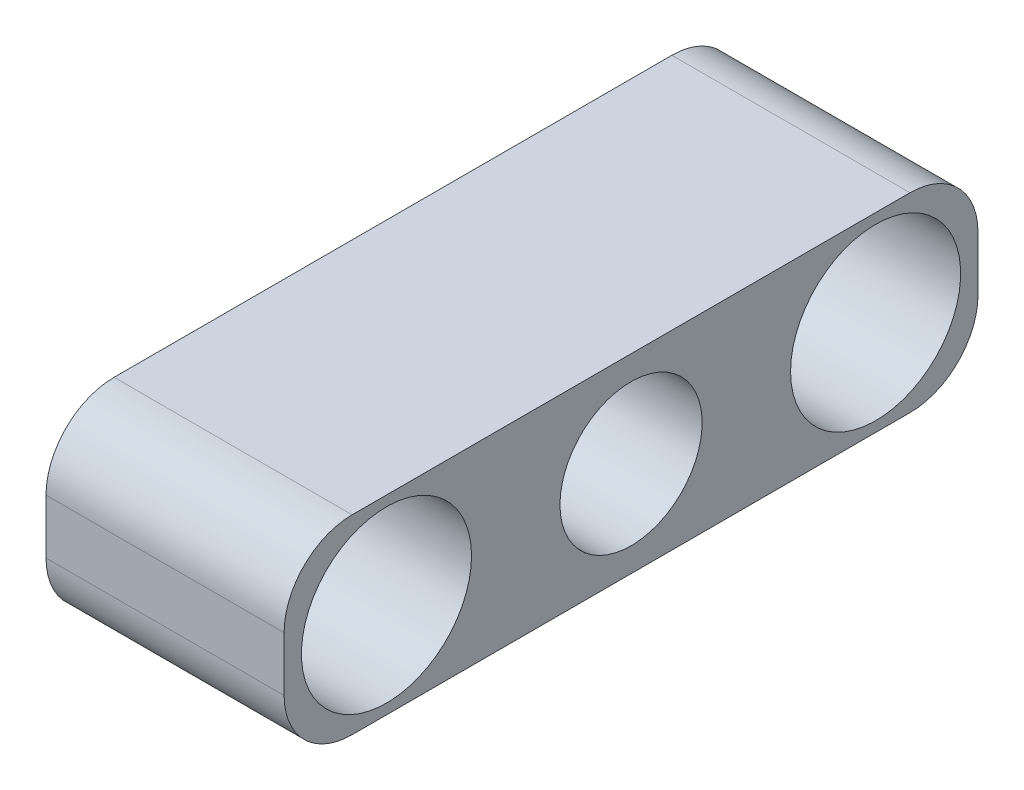
ISO-10303-21;
HEADER;
FILE_DESCRIPTION(('STEP AP214'),'2;1');
FILE_NAME('part.step','',(''),(''),'','','');
FILE_SCHEMA(('AUTOMOTIVE_DESIGN { 1 0 10303 214 1 1 1 1 }'));
ENDSEC;
DATA;
#1=APPLICATION_CONTEXT('core data for automotive mechanical design processes');
#2=APPLICATION_PROTOCOL_DEFINITION('international standard','automotive_design',2000,#1);
#3=PRODUCT_CONTEXT('',#1,'mechanical');
#4=PRODUCT('Part','Part','',(#3));
#5=PRODUCT_RELATED_PRODUCT_CATEGORY('part','',(#4));
#6=PRODUCT_DEFINITION_FORMATION('','',#4);
#7=PRODUCT_DEFINITION_CONTEXT('part definition',#1,'design');
#8=PRODUCT_DEFINITION('design','',#6,#7);
#9=PRODUCT_DEFINITION_SHAPE('','',#8);
#10=(LENGTH_UNIT() NAMED_UNIT(*) SI_UNIT(.MILLI.,.METRE.));
#11=(NAMED_UNIT(*) PLANE_ANGLE_UNIT() SI_UNIT($,.RADIAN.));
#12=(NAMED_UNIT(*) SI_UNIT($,.STERADIAN.) SOLID_ANGLE_UNIT());
#13=UNCERTAINTY_MEASURE_WITH_UNIT(LENGTH_MEASURE(1.E-05),#10,'distance_accuracy_value','');
#14=(GEOMETRIC_REPRESENTATION_CONTEXT(3) GLOBAL_UNCERTAINTY_ASSIGNED_CONTEXT((#13)) GLOBAL_UNIT_ASSIGNED_CONTEXT((#10,
#11,#12)) REPRESENTATION_CONTEXT('',''));
#15=CARTESIAN_POINT('',(0.,0.,0.));
#16=DIRECTION('',(0.,0.,1.));
#17=DIRECTION('',(1.,0.,0.));
#18=AXIS2_PLACEMENT_3D('',#15,#16,#17);
#19=CARTESIAN_POINT('',(-17.,-4.0000000000191,-41.0000000000019));
#20=DIRECTION('',(1.,0.,0.));
#21=DIRECTION('',(0.,0.,-1.));
#22=AXIS2_PLACEMENT_3D('',#19,#20,#21);
#23=CYLINDRICAL_SURFACE('',#22,10.);
#24=DIRECTION('',(-1.,0.,0.));
#25=VECTOR('',#24,1.);
#26=CARTESIAN_POINT('',(-17.,-4.0000000000191,-51.0000000000019));
#27=LINE('',#26,#25);
#28=CARTESIAN_POINT('',(18.,-4.0000000000191,-51.0000000000019));
#29=VERTEX_POINT('',#28);
#30=CARTESIAN_POINT('',(-17.,-4.0000000000191,-51.0000000000019));
#31=VERTEX_POINT('',#30);
#32=EDGE_CURVE('E156',#29,#31,#27,.T.);
#33=ORIENTED_EDGE('',*,*,#32,.F.);
#34=CARTESIAN_POINT('',(18.,-4.0000000000191,-41.0000000000019));
#35=DIRECTION('',(-1.,0.,0.));
#36=DIRECTION('',(0.,0.,1.));
#37=AXIS2_PLACEMENT_3D('',#34,#35,#36);
#38=CIRCLE('',#37,10.);
#39=CARTESIAN_POINT('',(18.,-14.00000000001,-40.9999999999968));
#40=VERTEX_POINT('',#39);
#41=EDGE_CURVE('E46',#40,#29,#38,.F.);
#42=ORIENTED_EDGE('',*,*,#41,.F.);
#43=DIRECTION('',(-1.,0.,0.));
#44=VECTOR('',#43,1.);
#45=CARTESIAN_POINT('',(-17.,-14.00000000001,-41.0000000000019));
#46=LINE('',#45,#44);
#47=CARTESIAN_POINT('',(-17.,-14.00000000001,-40.9999999999968));
#48=VERTEX_POINT('',#47);
#49=EDGE_CURVE('E161',#48,#40,#46,.F.);
#50=ORIENTED_EDGE('',*,*,#49,.F.);
#51=CARTESIAN_POINT('',(-17.,-4.0000000000191,-41.0000000000019));
#52=DIRECTION('',(-1.,0.,0.));
#53=DIRECTION('',(0.,0.,1.));
#54=AXIS2_PLACEMENT_3D('',#51,#52,#53);
#55=CIRCLE('',#54,10.);
#56=EDGE_CURVE('E11',#31,#48,#55,.T.);
#57=ORIENTED_EDGE('',*,*,#56,.F.);
#58=EDGE_LOOP('',(#33,#42,#50,#57));
#59=FACE_BOUND('',#58,.T.);
#60=ADVANCED_FACE('F39',(#59),#23,.T.);
#61=CARTESIAN_POINT('',(-17.,4.0000000000191,-41.0000000000019));
#62=DIRECTION('',(-1.,0.,0.));
#63=DIRECTION('',(0.,0.,1.));
#64=AXIS2_PLACEMENT_3D('',#61,#62,#63);
#65=CYLINDRICAL_SURFACE('',#64,10.);
#66=DIRECTION('',(1.,0.,0.));
#67=VECTOR('',#66,1.);
#68=CARTESIAN_POINT('',(-17.,4.0000000000191,-51.0000000000019));
#69=LINE('',#68,#67);
#70=CARTESIAN_POINT('',(-17.,4.0000000000191,-51.0000000000019));
#71=VERTEX_POINT('',#70);
#72=CARTESIAN_POINT('',(18.,4.0000000000191,-51.0000000000019));
#73=VERTEX_POINT('',#72);
#74=EDGE_CURVE('E148',#71,#73,#69,.T.);
#75=ORIENTED_EDGE('',*,*,#74,.F.);
#76=CARTESIAN_POINT('',(-17.,4.0000000000191,-41.0000000000019));
#77=DIRECTION('',(-1.,0.,0.));
#78=DIRECTION('',(0.,0.,1.));
#79=AXIS2_PLACEMENT_3D('',#76,#77,#78);
#80=CIRCLE('',#79,10.);
#81=CARTESIAN_POINT('',(-17.,14.00000000001,-40.9999999999968));
#82=VERTEX_POINT('',#81);
#83=EDGE_CURVE('E158',#82,#71,#80,.T.);
#84=ORIENTED_EDGE('',*,*,#83,.F.);
#85=DIRECTION('',(1.,0.,0.));
#86=VECTOR('',#85,1.);
#87=CARTESIAN_POINT('',(-17.,14.00000000001,-41.0000000000019));
#88=LINE('',#87,#86);
#89=CARTESIAN_POINT('',(18.,14.00000000001,-40.9999999999968));
#90=VERTEX_POINT('',#89);
#91=EDGE_CURVE('E151',#90,#82,#88,.F.);
#92=ORIENTED_EDGE('',*,*,#91,.F.);
#93=CARTESIAN_POINT('',(18.,4.0000000000191,-41.0000000000019));
#94=DIRECTION('',(-1.,0.,0.));
#95=DIRECTION('',(0.,0.,1.));
#96=AXIS2_PLACEMENT_3D('',#93,#94,#95);
#97=CIRCLE('',#96,10.);
#98=EDGE_CURVE('E157',#73,#90,#97,.F.);
#99=ORIENTED_EDGE('',*,*,#98,.F.);
#100=EDGE_LOOP('',(#75,#84,#92,#99));
#101=FACE_BOUND('',#100,.T.);
#102=ADVANCED_FACE('F207',(#101),#65,.T.);
#103=CARTESIAN_POINT('',(-17.,-4.0000000000191,41.0000000000019));
#104=DIRECTION('',(1.,0.,0.));
#105=DIRECTION('',(0.,0.,-1.));
#106=AXIS2_PLACEMENT_3D('',#103,#104,#105);
#107=CYLINDRICAL_SURFACE('',#106,10.);
#108=DIRECTION('',(1.,0.,0.));
#109=VECTOR('',#108,1.);
#110=CARTESIAN_POINT('',(-17.,-4.0000000000191,51.0000000000019));
#111=LINE('',#110,#109);
#112=CARTESIAN_POINT('',(-17.,-4.0000000000191,51.0000000000019));
#113=VERTEX_POINT('',#112);
#114=CARTESIAN_POINT('',(18.,-4.0000000000191,51.0000000000019));
#115=VERTEX_POINT('',#114);
#116=EDGE_CURVE('E130',#113,#115,#111,.T.);
#117=ORIENTED_EDGE('',*,*,#116,.F.);
#118=CARTESIAN_POINT('',(-17.,-4.0000000000191,41.0000000000019));
#119=DIRECTION('',(-1.,0.,0.));
#120=DIRECTION('',(0.,0.,1.));
#121=AXIS2_PLACEMENT_3D('',#118,#119,#120);
#122=CIRCLE('',#121,10.);
#123=CARTESIAN_POINT('',(-17.,-14.00000000001,40.9999999999968));
#124=VERTEX_POINT('',#123);
#125=EDGE_CURVE('E147',#124,#113,#122,.T.);
#126=ORIENTED_EDGE('',*,*,#125,.F.);
#127=DIRECTION('',(1.,0.,0.));
#128=VECTOR('',#127,1.);
#129=CARTESIAN_POINT('',(-17.,-14.00000000001,40.9999999999968));
#130=LINE('',#129,#128);
#131=CARTESIAN_POINT('',(18.,-14.00000000001,40.9999999999968));
#132=VERTEX_POINT('',#131);
#133=EDGE_CURVE('E141',#132,#124,#130,.F.);
#134=ORIENTED_EDGE('',*,*,#133,.F.);
#135=CARTESIAN_POINT('',(18.,-4.0000000000191,41.0000000000019));
#136=DIRECTION('',(-1.,0.,0.));
#137=DIRECTION('',(0.,0.,1.));
#138=AXIS2_PLACEMENT_3D('',#135,#136,#137);
#139=CIRCLE('',#138,10.);
#140=EDGE_CURVE('E150',#115,#132,#139,.F.);
#141=ORIENTED_EDGE('',*,*,#140,.F.);
#142=EDGE_LOOP('',(#117,#126,#134,#141));
#143=FACE_BOUND('',#142,.T.);
#144=ADVANCED_FACE('F212',(#143),#107,.T.);
#145=CARTESIAN_POINT('',(-17.,4.0000000000191,41.0000000000019));
#146=DIRECTION('',(-1.,0.,0.));
#147=DIRECTION('',(0.,0.,1.));
#148=AXIS2_PLACEMENT_3D('',#145,#146,#147);
#149=CYLINDRICAL_SURFACE('',#148,10.);
#150=DIRECTION('',(-1.,0.,0.));
#151=VECTOR('',#150,1.);
#152=CARTESIAN_POINT('',(-17.,4.0000000000191,51.0000000000019));
#153=LINE('',#152,#151);
#154=CARTESIAN_POINT('',(18.,4.0000000000191,51.0000000000019));
#155=VERTEX_POINT('',#154);
#156=CARTESIAN_POINT('',(-17.,4.0000000000191,51.0000000000019));
#157=VERTEX_POINT('',#156);
#158=EDGE_CURVE('E120',#155,#157,#153,.T.);
#159=ORIENTED_EDGE('',*,*,#158,.F.);
#160=CARTESIAN_POINT('',(18.,4.0000000000191,41.0000000000019));
#161=DIRECTION('',(-1.,0.,0.));
#162=DIRECTION('',(0.,0.,1.));
#163=AXIS2_PLACEMENT_3D('',#160,#161,#162);
#164=CIRCLE('',#163,10.);
#165=CARTESIAN_POINT('',(18.,14.00000000001,40.9999999999968));
#166=VERTEX_POINT('',#165);
#167=EDGE_CURVE('E103',#166,#155,#164,.F.);
#168=ORIENTED_EDGE('',*,*,#167,.F.);
#169=DIRECTION('',(-1.,0.,0.));
#170=VECTOR('',#169,1.);
#171=CARTESIAN_POINT('',(-17.,14.00000000001,40.9999999999968));
#172=LINE('',#171,#170);
#173=CARTESIAN_POINT('',(-17.,14.00000000001,40.9999999999968));
#174=VERTEX_POINT('',#173);
#175=EDGE_CURVE('E112',#174,#166,#172,.F.);
#176=ORIENTED_EDGE('',*,*,#175,.F.);
#177=CARTESIAN_POINT('',(-17.,4.0000000000191,41.0000000000019));
#178=DIRECTION('',(-1.,0.,0.));
#179=DIRECTION('',(0.,0.,1.));
#180=AXIS2_PLACEMENT_3D('',#177,#178,#179);
#181=CIRCLE('',#180,10.);
#182=EDGE_CURVE('E113',#157,#174,#181,.T.);
#183=ORIENTED_EDGE('',*,*,#182,.F.);
#184=EDGE_LOOP('',(#159,#168,#176,#183));
#185=FACE_BOUND('',#184,.T.);
#186=ADVANCED_FACE('F117',(#185),#149,.T.);
#187=CARTESIAN_POINT('',(-17.,-14.00000000001,116758.401593134));
#188=DIRECTION('',(0.,-1.,0.));
#189=DIRECTION('',(0.,0.,-1.));
#190=AXIS2_PLACEMENT_3D('',#187,#188,#189);
#191=PLANE('',#190);
#192=DIRECTION('',(0.,0.,-1.));
#193=VECTOR('',#192,1.);
#194=CARTESIAN_POINT('',(-17.,-14.00000000001,116758.401593134));
#195=LINE('',#194,#193);
#196=EDGE_CURVE('E126',#124,#48,#195,.T.);
#197=ORIENTED_EDGE('',*,*,#196,.T.);
#198=ORIENTED_EDGE('',*,*,#49,.T.);
#199=DIRECTION('',(0.,0.,-1.));
#200=VECTOR('',#199,1.);
#201=CARTESIAN_POINT('',(18.,-14.00000000001,116758.401593134));
#202=LINE('',#201,#200);
#203=EDGE_CURVE('E132',#132,#40,#202,.T.);
#204=ORIENTED_EDGE('',*,*,#203,.F.);
#205=ORIENTED_EDGE('',*,*,#133,.T.);
#206=EDGE_LOOP('',(#197,#198,#204,#205));
#207=FACE_BOUND('',#206,.T.);
#208=ADVANCED_FACE('F224',(#207),#191,.T.);
#209=CARTESIAN_POINT('',(-17.,-481034.717744328,51.0000000000019));
#210=DIRECTION('',(0.,0.,1.));
#211=DIRECTION('',(1.,0.,0.));
#212=AXIS2_PLACEMENT_3D('',#209,#210,#211);
#213=PLANE('',#212);
#214=DIRECTION('',(0.,-1.,0.));
#215=VECTOR('',#214,1.);
#216=CARTESIAN_POINT('',(-17.,-481034.717744328,51.0000000000019));
#217=LINE('',#216,#215);
#218=EDGE_CURVE('E124',#157,#113,#217,.T.);
#219=ORIENTED_EDGE('',*,*,#218,.T.);
#220=ORIENTED_EDGE('',*,*,#116,.T.);
#221=DIRECTION('',(0.,-1.,0.));
#222=VECTOR('',#221,1.);
#223=CARTESIAN_POINT('',(18.,-481034.717744328,51.0000000000019));
#224=LINE('',#223,#222);
#225=EDGE_CURVE('E110',#155,#115,#224,.T.);
#226=ORIENTED_EDGE('',*,*,#225,.F.);
#227=ORIENTED_EDGE('',*,*,#158,.T.);
#228=EDGE_LOOP('',(#219,#220,#226,#227));
#229=FACE_BOUND('',#228,.T.);
#230=ADVANCED_FACE('F127',(#229),#213,.T.);
#231=CARTESIAN_POINT('',(-17.,14.00000000001,116758.401593134));
#232=DIRECTION('',(0.,1.,0.));
#233=DIRECTION('',(0.,0.,1.));
#234=AXIS2_PLACEMENT_3D('',#231,#232,#233);
#235=PLANE('',#234);
#236=DIRECTION('',(0.,0.,1.));
#237=VECTOR('',#236,1.);
#238=CARTESIAN_POINT('',(18.,14.00000000001,116758.401593134));
#239=LINE('',#238,#237);
#240=EDGE_CURVE('E107',#90,#166,#239,.T.);
#241=ORIENTED_EDGE('',*,*,#240,.F.);
#242=ORIENTED_EDGE('',*,*,#91,.T.);
#243=DIRECTION('',(0.,0.,1.));
#244=VECTOR('',#243,1.);
#245=CARTESIAN_POINT('',(-17.,14.00000000001,116758.401593134));
#246=LINE('',#245,#244);
#247=EDGE_CURVE('E135',#82,#174,#246,.T.);
#248=ORIENTED_EDGE('',*,*,#247,.T.);
#249=ORIENTED_EDGE('',*,*,#175,.T.);
#250=EDGE_LOOP('',(#241,#242,#248,#249));
#251=FACE_BOUND('',#250,.T.);
#252=ADVANCED_FACE('F199',(#251),#235,.T.);
#253=CARTESIAN_POINT('',(-17.,0.,0.));
#254=DIRECTION('',(-1.,0.,0.));
#255=DIRECTION('',(0.,0.,1.));
#256=AXIS2_PLACEMENT_3D('',#253,#254,#255);
#257=PLANE('',#256);
#258=CARTESIAN_POINT('',(-17.,0.,-35.95));
#259=DIRECTION('',(-1.,0.,0.));
#260=DIRECTION('',(0.,0.,1.));
#261=AXIS2_PLACEMENT_3D('',#258,#259,#260);
#262=CIRCLE('',#261,12.5);
#263=CARTESIAN_POINT('',(-17.,0.,-23.45));
#264=VERTEX_POINT('',#263);
#265=EDGE_CURVE('E344',#264,#264,#262,.T.);
#266=ORIENTED_EDGE('',*,*,#265,.F.);
#267=EDGE_LOOP('',(#266));
#268=FACE_BOUND('',#267,.T.);
#269=CARTESIAN_POINT('',(-17.,0.,0.));
#270=DIRECTION('',(-1.,0.,0.));
#271=DIRECTION('',(0.,0.,1.));
#272=AXIS2_PLACEMENT_3D('',#269,#270,#271);
#273=CIRCLE('',#272,6.5);
#274=CARTESIAN_POINT('',(-17.,0.,6.5));
#275=VERTEX_POINT('',#274);
#276=EDGE_CURVE('E347',#275,#275,#273,.T.);
#277=ORIENTED_EDGE('',*,*,#276,.F.);
#278=EDGE_LOOP('',(#277));
#279=FACE_BOUND('',#278,.T.);
#280=DIRECTION('',(0.,-1.,0.));
#281=VECTOR('',#280,1.);
#282=CARTESIAN_POINT('',(-17.,-481034.717744328,-51.0000000000019));
#283=LINE('',#282,#281);
#284=EDGE_CURVE('E175',#71,#31,#283,.T.);
#285=ORIENTED_EDGE('',*,*,#284,.T.);
#286=ORIENTED_EDGE('',*,*,#56,.T.);
#287=ORIENTED_EDGE('',*,*,#196,.F.);
#288=ORIENTED_EDGE('',*,*,#125,.T.);
#289=ORIENTED_EDGE('',*,*,#218,.F.);
#290=ORIENTED_EDGE('',*,*,#182,.T.);
#291=ORIENTED_EDGE('',*,*,#247,.F.);
#292=ORIENTED_EDGE('',*,*,#83,.T.);
#293=EDGE_LOOP('',(#285,#286,#287,#288,#289,#290,#291,#292));
#294=FACE_BOUND('',#293,.T.);
#295=CARTESIAN_POINT('',(-17.,0.,35.95));
#296=DIRECTION('',(1.,0.,0.));
#297=DIRECTION('',(0.,0.,-1.));
#298=AXIS2_PLACEMENT_3D('',#295,#296,#297);
#299=CIRCLE('',#298,12.5);
#300=CARTESIAN_POINT('',(-17.,0.,23.45));
#301=VERTEX_POINT('',#300);
#302=EDGE_CURVE('E185',#301,#301,#299,.T.);
#303=ORIENTED_EDGE('',*,*,#302,.T.);
#304=EDGE_LOOP('',(#303));
#305=FACE_BOUND('',#304,.T.);
#306=ADVANCED_FACE('F188',(#268,#279,#294,#305),#257,.T.);
#307=CARTESIAN_POINT('',(18.,0.,0.));
#308=DIRECTION('',(-1.,0.,0.));
#309=DIRECTION('',(0.,0.,1.));
#310=AXIS2_PLACEMENT_3D('',#307,#308,#309);
#311=PLANE('',#310);
#312=CARTESIAN_POINT('',(18.,0.,-35.95));
#313=DIRECTION('',(-1.,0.,0.));
#314=DIRECTION('',(0.,0.,1.));
#315=AXIS2_PLACEMENT_3D('',#312,#313,#314);
#316=CIRCLE('',#315,12.5);
#317=CARTESIAN_POINT('',(18.,0.,-23.45));
#318=VERTEX_POINT('',#317);
#319=EDGE_CURVE('E341',#318,#318,#316,.T.);
#320=ORIENTED_EDGE('',*,*,#319,.T.);
#321=EDGE_LOOP('',(#320));
#322=FACE_BOUND('',#321,.T.);
#323=CARTESIAN_POINT('',(18.,0.,0.));
#324=DIRECTION('',(-1.,0.,0.));
#325=DIRECTION('',(0.,0.,1.));
#326=AXIS2_PLACEMENT_3D('',#323,#324,#325);
#327=CIRCLE('',#326,10.45);
#328=CARTESIAN_POINT('',(18.,0.,10.45));
#329=VERTEX_POINT('',#328);
#330=EDGE_CURVE('E178',#329,#329,#327,.T.);
#331=ORIENTED_EDGE('',*,*,#330,.T.);
#332=EDGE_LOOP('',(#331));
#333=FACE_BOUND('',#332,.T.);
#334=ORIENTED_EDGE('',*,*,#203,.T.);
#335=ORIENTED_EDGE('',*,*,#41,.T.);
#336=DIRECTION('',(0.,-1.,0.));
#337=VECTOR('',#336,1.);
#338=CARTESIAN_POINT('',(18.,-481034.717744328,-51.0000000000019));
#339=LINE('',#338,#337);
#340=EDGE_CURVE('E168',#73,#29,#339,.T.);
#341=ORIENTED_EDGE('',*,*,#340,.F.);
#342=ORIENTED_EDGE('',*,*,#98,.T.);
#343=ORIENTED_EDGE('',*,*,#240,.T.);
#344=ORIENTED_EDGE('',*,*,#167,.T.);
#345=ORIENTED_EDGE('',*,*,#225,.T.);
#346=ORIENTED_EDGE('',*,*,#140,.T.);
#347=EDGE_LOOP('',(#334,#335,#341,#342,#343,#344,#345,#346));
#348=FACE_BOUND('',#347,.T.);
#349=CARTESIAN_POINT('',(18.,0.,35.95));
#350=DIRECTION('',(1.,0.,0.));
#351=DIRECTION('',(0.,0.,-1.));
#352=AXIS2_PLACEMENT_3D('',#349,#350,#351);
#353=CIRCLE('',#352,12.5);
#354=CARTESIAN_POINT('',(18.,0.,23.45));
#355=VERTEX_POINT('',#354);
#356=EDGE_CURVE('E174',#355,#355,#353,.T.);
#357=ORIENTED_EDGE('',*,*,#356,.F.);
#358=EDGE_LOOP('',(#357));
#359=FACE_BOUND('',#358,.T.);
#360=ADVANCED_FACE('F104',(#322,#333,#348,#359),#311,.F.);
#361=CARTESIAN_POINT('',(-17.,0.,35.95));
#362=DIRECTION('',(1.,0.,0.));
#363=DIRECTION('',(0.,0.,-1.));
#364=AXIS2_PLACEMENT_3D('',#361,#362,#363);
#365=CYLINDRICAL_SURFACE('',#364,12.5);
#366=ORIENTED_EDGE('',*,*,#302,.F.);
#367=EDGE_LOOP('',(#366));
#368=FACE_BOUND('',#367,.T.);
#369=ORIENTED_EDGE('',*,*,#356,.T.);
#370=EDGE_LOOP('',(#369));
#371=FACE_BOUND('',#370,.T.);
#372=ADVANCED_FACE('F189',(#368,#371),#365,.F.);
#373=CARTESIAN_POINT('',(-17.,-481034.717744328,-51.0000000000019));
#374=DIRECTION('',(0.,0.,1.));
#375=DIRECTION('',(1.,0.,0.));
#376=AXIS2_PLACEMENT_3D('',#373,#374,#375);
#377=PLANE('',#376);
#378=ORIENTED_EDGE('',*,*,#340,.T.);
#379=ORIENTED_EDGE('',*,*,#32,.T.);
#380=ORIENTED_EDGE('',*,*,#284,.F.);
#381=ORIENTED_EDGE('',*,*,#74,.T.);
#382=EDGE_LOOP('',(#378,#379,#380,#381));
#383=FACE_BOUND('',#382,.T.);
#384=ADVANCED_FACE('F167',(#383),#377,.F.);
#385=CARTESIAN_POINT('',(-12.,0.,0.));
#386=DIRECTION('',(1.,0.,0.));
#387=DIRECTION('',(0.,0.,-1.));
#388=AXIS2_PLACEMENT_3D('',#385,#386,#387);
#389=CYLINDRICAL_SURFACE('',#388,10.45);
#390=CARTESIAN_POINT('',(-12.,0.,0.));
#391=DIRECTION('',(-1.,0.,0.));
#392=DIRECTION('',(0.,0.,1.));
#393=AXIS2_PLACEMENT_3D('',#390,#391,#392);
#394=CIRCLE('',#393,10.45);
#395=CARTESIAN_POINT('',(-12.,0.,10.45));
#396=VERTEX_POINT('',#395);
#397=EDGE_CURVE('E173',#396,#396,#394,.T.);
#398=ORIENTED_EDGE('',*,*,#397,.T.);
#399=EDGE_LOOP('',(#398));
#400=FACE_BOUND('',#399,.T.);
#401=ORIENTED_EDGE('',*,*,#330,.F.);
#402=EDGE_LOOP('',(#401));
#403=FACE_BOUND('',#402,.T.);
#404=ADVANCED_FACE('F290',(#400,#403),#389,.F.);
#405=CARTESIAN_POINT('',(-12.,0.,0.));
#406=DIRECTION('',(1.,0.,0.));
#407=DIRECTION('',(0.,0.,1.));
#408=AXIS2_PLACEMENT_3D('',#405,#406,#407);
#409=PLANE('',#408);
#410=CARTESIAN_POINT('',(-12.,0.,0.));
#411=DIRECTION('',(-1.,0.,0.));
#412=DIRECTION('',(0.,0.,1.));
#413=AXIS2_PLACEMENT_3D('',#410,#411,#412);
#414=CIRCLE('',#413,6.5);
#415=CARTESIAN_POINT('',(-12.,0.,6.5));
#416=VERTEX_POINT('',#415);
#417=EDGE_CURVE('E348',#416,#416,#414,.T.);
#418=ORIENTED_EDGE('',*,*,#417,.T.);
#419=EDGE_LOOP('',(#418));
#420=FACE_BOUND('',#419,.T.);
#421=ORIENTED_EDGE('',*,*,#397,.F.);
#422=EDGE_LOOP('',(#421));
#423=FACE_BOUND('',#422,.T.);
#424=ADVANCED_FACE('F296',(#420,#423),#409,.T.);
#425=CARTESIAN_POINT('',(-17.,0.,0.));
#426=DIRECTION('',(1.,0.,0.));
#427=DIRECTION('',(0.,0.,-1.));
#428=AXIS2_PLACEMENT_3D('',#425,#426,#427);
#429=CYLINDRICAL_SURFACE('',#428,6.5);
#430=ORIENTED_EDGE('',*,*,#276,.T.);
#431=EDGE_LOOP('',(#430));
#432=FACE_BOUND('',#431,.T.);
#433=ORIENTED_EDGE('',*,*,#417,.F.);
#434=EDGE_LOOP('',(#433));
#435=FACE_BOUND('',#434,.T.);
#436=ADVANCED_FACE('F308',(#432,#435),#429,.F.);
#437=CARTESIAN_POINT('',(-17.,0.,-35.95));
#438=DIRECTION('',(1.,0.,0.));
#439=DIRECTION('',(0.,0.,-1.));
#440=AXIS2_PLACEMENT_3D('',#437,#438,#439);
#441=CYLINDRICAL_SURFACE('',#440,12.5);
#442=ORIENTED_EDGE('',*,*,#265,.T.);
#443=EDGE_LOOP('',(#442));
#444=FACE_BOUND('',#443,.T.);
#445=ORIENTED_EDGE('',*,*,#319,.F.);
#446=EDGE_LOOP('',(#445));
#447=FACE_BOUND('',#446,.T.);
#448=ADVANCED_FACE('F319',(#444,#447),#441,.F.);
#449=CLOSED_SHELL('',(#60,#102,#144,#186,#208,#230,#252,#306,#360,#372,#384,#404,#424,#436,#448));
#450=MANIFOLD_SOLID_BREP('B2',#449);
#451=ADVANCED_BREP_SHAPE_REPRESENTATION('',(#18,#450),#14);
#452=SHAPE_DEFINITION_REPRESENTATION(#9,#451);
ENDSEC;
END-ISO-10303-21;
